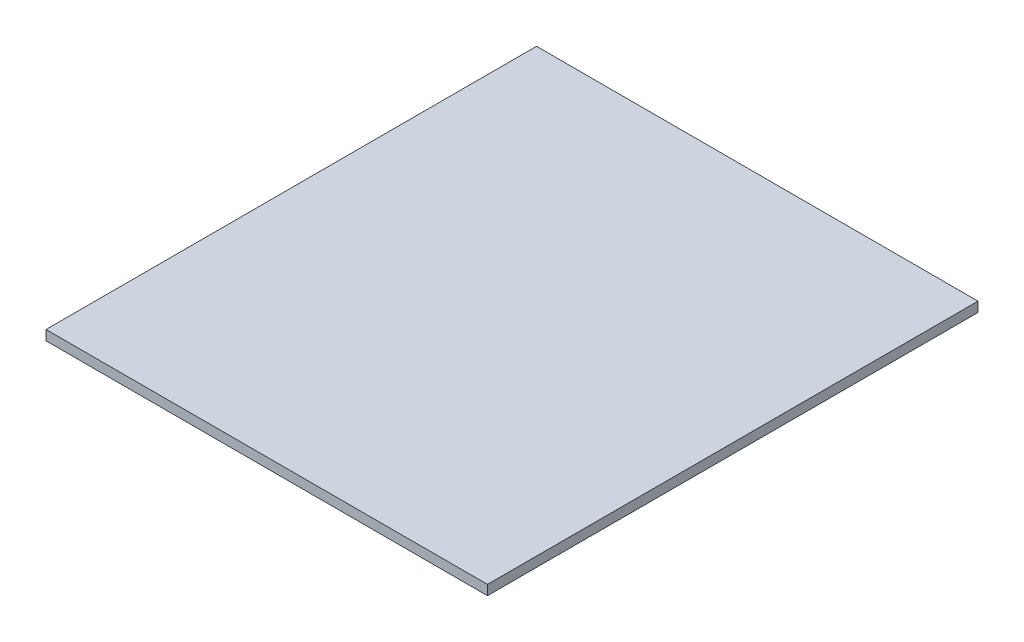
ISO-10303-21;
HEADER;
FILE_DESCRIPTION(('STEP AP214'),'2;1');
FILE_NAME('part.step','',(''),(''),'','','');
FILE_SCHEMA(('AUTOMOTIVE_DESIGN { 1 0 10303 214 1 1 1 1 }'));
ENDSEC;
DATA;
#1=APPLICATION_CONTEXT('core data for automotive mechanical design processes');
#2=APPLICATION_PROTOCOL_DEFINITION('international standard','automotive_design',2000,#1);
#3=PRODUCT_CONTEXT('',#1,'mechanical');
#4=PRODUCT('Part','Part','',(#3));
#5=PRODUCT_RELATED_PRODUCT_CATEGORY('part','',(#4));
#6=PRODUCT_DEFINITION_FORMATION('','',#4);
#7=PRODUCT_DEFINITION_CONTEXT('part definition',#1,'design');
#8=PRODUCT_DEFINITION('design','',#6,#7);
#9=PRODUCT_DEFINITION_SHAPE('','',#8);
#10=(LENGTH_UNIT() NAMED_UNIT(*) SI_UNIT(.MILLI.,.METRE.));
#11=(NAMED_UNIT(*) PLANE_ANGLE_UNIT() SI_UNIT($,.RADIAN.));
#12=(NAMED_UNIT(*) SI_UNIT($,.STERADIAN.) SOLID_ANGLE_UNIT());
#13=UNCERTAINTY_MEASURE_WITH_UNIT(LENGTH_MEASURE(1.E-05),#10,'distance_accuracy_value','');
#14=(GEOMETRIC_REPRESENTATION_CONTEXT(3) GLOBAL_UNCERTAINTY_ASSIGNED_CONTEXT((#13)) GLOBAL_UNIT_ASSIGNED_CONTEXT((#10,
#11,#12)) REPRESENTATION_CONTEXT('',''));
#15=CARTESIAN_POINT('',(0.,0.,0.));
#16=DIRECTION('',(0.,0.,1.));
#17=DIRECTION('',(1.,0.,0.));
#18=AXIS2_PLACEMENT_3D('',#15,#16,#17);
#19=CARTESIAN_POINT('',(0.,0.508,0.));
#20=DIRECTION('',(1.,0.,0.));
#21=DIRECTION('',(0.,0.,-1.));
#22=AXIS2_PLACEMENT_3D('',#19,#20,#21);
#23=PLANE('',#22);
#24=DIRECTION('',(0.,0.,1.));
#25=VECTOR('',#24,1.);
#26=CARTESIAN_POINT('',(0.,0.,0.));
#27=LINE('',#26,#25);
#28=CARTESIAN_POINT('',(0.,0.,-25.4));
#29=VERTEX_POINT('',#28);
#30=CARTESIAN_POINT('',(0.,0.,0.));
#31=VERTEX_POINT('',#30);
#32=EDGE_CURVE('E107',#29,#31,#27,.T.);
#33=ORIENTED_EDGE('',*,*,#32,.T.);
#34=DIRECTION('',(0.,-1.,0.));
#35=VECTOR('',#34,1.);
#36=CARTESIAN_POINT('',(0.,0.508,0.));
#37=LINE('',#36,#35);
#38=CARTESIAN_POINT('',(0.,0.508,0.));
#39=VERTEX_POINT('',#38);
#40=EDGE_CURVE('E11',#39,#31,#37,.T.);
#41=ORIENTED_EDGE('',*,*,#40,.F.);
#42=DIRECTION('',(0.,0.,1.));
#43=VECTOR('',#42,1.);
#44=CARTESIAN_POINT('',(0.,0.508,0.));
#45=LINE('',#44,#43);
#46=CARTESIAN_POINT('',(0.,0.508,-25.4));
#47=VERTEX_POINT('',#46);
#48=EDGE_CURVE('E91',#47,#39,#45,.T.);
#49=ORIENTED_EDGE('',*,*,#48,.F.);
#50=DIRECTION('',(0.,-1.,0.));
#51=VECTOR('',#50,1.);
#52=CARTESIAN_POINT('',(0.,0.508,-25.4));
#53=LINE('',#52,#51);
#54=EDGE_CURVE('E103',#47,#29,#53,.T.);
#55=ORIENTED_EDGE('',*,*,#54,.T.);
#56=EDGE_LOOP('',(#33,#41,#49,#55));
#57=FACE_BOUND('',#56,.T.);
#58=ADVANCED_FACE('F39',(#57),#23,.F.);
#59=CARTESIAN_POINT('',(0.,0.508,0.));
#60=DIRECTION('',(0.,0.,-1.));
#61=DIRECTION('',(-1.,0.,0.));
#62=AXIS2_PLACEMENT_3D('',#59,#60,#61);
#63=PLANE('',#62);
#64=DIRECTION('',(1.,0.,0.));
#65=VECTOR('',#64,1.);
#66=CARTESIAN_POINT('',(0.,0.,0.));
#67=LINE('',#66,#65);
#68=CARTESIAN_POINT('',(22.86,0.,0.));
#69=VERTEX_POINT('',#68);
#70=EDGE_CURVE('E96',#31,#69,#67,.T.);
#71=ORIENTED_EDGE('',*,*,#70,.T.);
#72=DIRECTION('',(0.,-1.,0.));
#73=VECTOR('',#72,1.);
#74=CARTESIAN_POINT('',(22.86,0.508,0.));
#75=LINE('',#74,#73);
#76=CARTESIAN_POINT('',(22.86,0.508,0.));
#77=VERTEX_POINT('',#76);
#78=EDGE_CURVE('E48',#77,#69,#75,.T.);
#79=ORIENTED_EDGE('',*,*,#78,.F.);
#80=DIRECTION('',(1.,0.,0.));
#81=VECTOR('',#80,1.);
#82=CARTESIAN_POINT('',(0.,0.508,0.));
#83=LINE('',#82,#81);
#84=EDGE_CURVE('E86',#39,#77,#83,.T.);
#85=ORIENTED_EDGE('',*,*,#84,.F.);
#86=ORIENTED_EDGE('',*,*,#40,.T.);
#87=EDGE_LOOP('',(#71,#79,#85,#86));
#88=FACE_BOUND('',#87,.T.);
#89=ADVANCED_FACE('F95',(#88),#63,.F.);
#90=CARTESIAN_POINT('',(22.86,0.508,0.));
#91=DIRECTION('',(-1.,0.,0.));
#92=DIRECTION('',(0.,0.,1.));
#93=AXIS2_PLACEMENT_3D('',#90,#91,#92);
#94=PLANE('',#93);
#95=DIRECTION('',(0.,0.,-1.));
#96=VECTOR('',#95,1.);
#97=CARTESIAN_POINT('',(22.86,0.,0.));
#98=LINE('',#97,#96);
#99=CARTESIAN_POINT('',(22.86,0.,-25.4));
#100=VERTEX_POINT('',#99);
#101=EDGE_CURVE('E73',#69,#100,#98,.T.);
#102=ORIENTED_EDGE('',*,*,#101,.T.);
#103=DIRECTION('',(0.,-1.,0.));
#104=VECTOR('',#103,1.);
#105=CARTESIAN_POINT('',(22.86,0.508,-25.4));
#106=LINE('',#105,#104);
#107=CARTESIAN_POINT('',(22.86,0.508,-25.4));
#108=VERTEX_POINT('',#107);
#109=EDGE_CURVE('E98',#108,#100,#106,.T.);
#110=ORIENTED_EDGE('',*,*,#109,.F.);
#111=DIRECTION('',(0.,0.,-1.));
#112=VECTOR('',#111,1.);
#113=CARTESIAN_POINT('',(22.86,0.508,0.));
#114=LINE('',#113,#112);
#115=EDGE_CURVE('E89',#77,#108,#114,.T.);
#116=ORIENTED_EDGE('',*,*,#115,.F.);
#117=ORIENTED_EDGE('',*,*,#78,.T.);
#118=EDGE_LOOP('',(#102,#110,#116,#117));
#119=FACE_BOUND('',#118,.T.);
#120=ADVANCED_FACE('F99',(#119),#94,.F.);
#121=CARTESIAN_POINT('',(0.,0.508,-25.4));
#122=DIRECTION('',(0.,0.,1.));
#123=DIRECTION('',(1.,0.,0.));
#124=AXIS2_PLACEMENT_3D('',#121,#122,#123);
#125=PLANE('',#124);
#126=DIRECTION('',(-1.,0.,0.));
#127=VECTOR('',#126,1.);
#128=CARTESIAN_POINT('',(0.,0.,-25.4));
#129=LINE('',#128,#127);
#130=EDGE_CURVE('E79',#100,#29,#129,.T.);
#131=ORIENTED_EDGE('',*,*,#130,.T.);
#132=ORIENTED_EDGE('',*,*,#54,.F.);
#133=DIRECTION('',(-1.,0.,0.));
#134=VECTOR('',#133,1.);
#135=CARTESIAN_POINT('',(0.,0.508,-25.4));
#136=LINE('',#135,#134);
#137=EDGE_CURVE('E56',#108,#47,#136,.T.);
#138=ORIENTED_EDGE('',*,*,#137,.F.);
#139=ORIENTED_EDGE('',*,*,#109,.T.);
#140=EDGE_LOOP('',(#131,#132,#138,#139));
#141=FACE_BOUND('',#140,.T.);
#142=ADVANCED_FACE('F120',(#141),#125,.F.);
#143=CARTESIAN_POINT('',(0.,0.508,0.));
#144=DIRECTION('',(0.,-1.,0.));
#145=DIRECTION('',(0.,0.,-1.));
#146=AXIS2_PLACEMENT_3D('',#143,#144,#145);
#147=PLANE('',#146);
#148=ORIENTED_EDGE('',*,*,#48,.T.);
#149=ORIENTED_EDGE('',*,*,#84,.T.);
#150=ORIENTED_EDGE('',*,*,#115,.T.);
#151=ORIENTED_EDGE('',*,*,#137,.T.);
#152=EDGE_LOOP('',(#148,#149,#150,#151));
#153=FACE_BOUND('',#152,.T.);
#154=ADVANCED_FACE('F87',(#153),#147,.F.);
#155=CARTESIAN_POINT('',(0.,0.,0.));
#156=DIRECTION('',(0.,-1.,0.));
#157=DIRECTION('',(0.,0.,-1.));
#158=AXIS2_PLACEMENT_3D('',#155,#156,#157);
#159=PLANE('',#158);
#160=ORIENTED_EDGE('',*,*,#32,.F.);
#161=ORIENTED_EDGE('',*,*,#130,.F.);
#162=ORIENTED_EDGE('',*,*,#101,.F.);
#163=ORIENTED_EDGE('',*,*,#70,.F.);
#164=EDGE_LOOP('',(#160,#161,#162,#163));
#165=FACE_BOUND('',#164,.T.);
#166=ADVANCED_FACE('F123',(#165),#159,.T.);
#167=CLOSED_SHELL('',(#58,#89,#120,#142,#154,#166));
#168=MANIFOLD_SOLID_BREP('B2',#167);
#169=ADVANCED_BREP_SHAPE_REPRESENTATION('',(#18,#168),#14);
#170=SHAPE_DEFINITION_REPRESENTATION(#9,#169);
ENDSEC;
END-ISO-10303-21;
